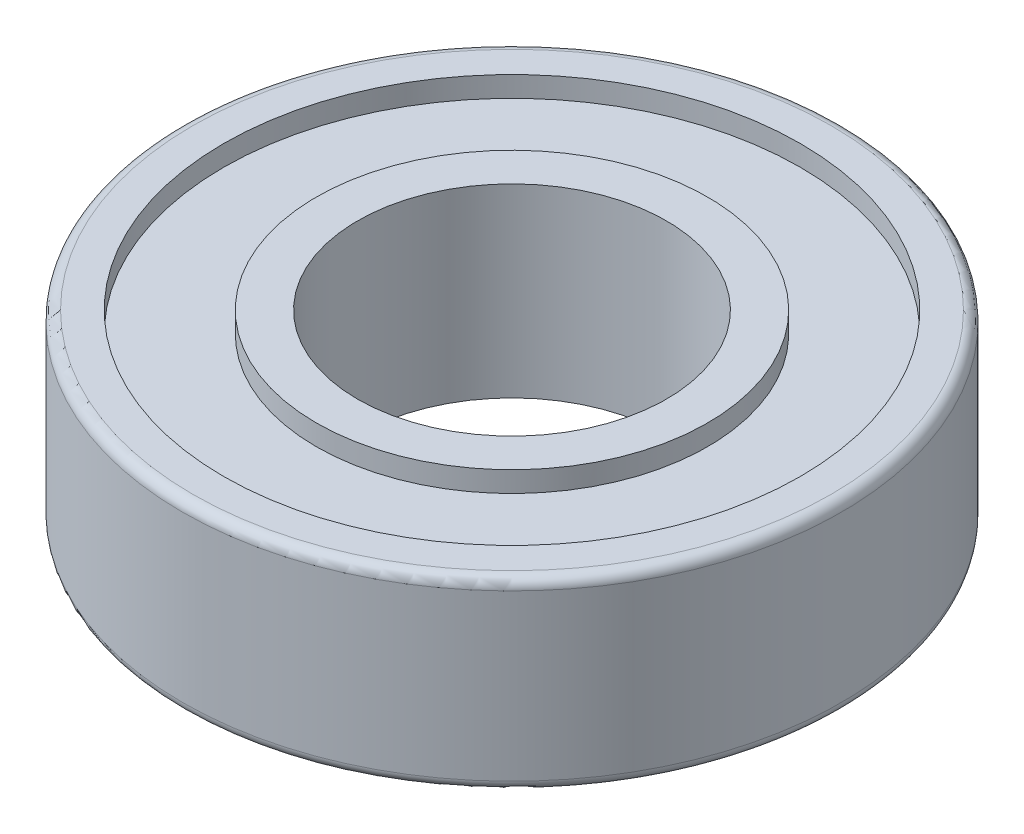
ISO-10303-21;
HEADER;
FILE_DESCRIPTION(('STEP AP214'),'2;1');
FILE_NAME('part.step','',(''),(''),'','','');
FILE_SCHEMA(('AUTOMOTIVE_DESIGN { 1 0 10303 214 1 1 1 1 }'));
ENDSEC;
DATA;
#1=APPLICATION_CONTEXT('core data for automotive mechanical design processes');
#2=APPLICATION_PROTOCOL_DEFINITION('international standard','automotive_design',2000,#1);
#3=PRODUCT_CONTEXT('',#1,'mechanical');
#4=PRODUCT('Part','Part','',(#3));
#5=PRODUCT_RELATED_PRODUCT_CATEGORY('part','',(#4));
#6=PRODUCT_DEFINITION_FORMATION('','',#4);
#7=PRODUCT_DEFINITION_CONTEXT('part definition',#1,'design');
#8=PRODUCT_DEFINITION('design','',#6,#7);
#9=PRODUCT_DEFINITION_SHAPE('','',#8);
#10=(LENGTH_UNIT() NAMED_UNIT(*) SI_UNIT(.MILLI.,.METRE.));
#11=(NAMED_UNIT(*) PLANE_ANGLE_UNIT() SI_UNIT($,.RADIAN.));
#12=(NAMED_UNIT(*) SI_UNIT($,.STERADIAN.) SOLID_ANGLE_UNIT());
#13=UNCERTAINTY_MEASURE_WITH_UNIT(LENGTH_MEASURE(1.E-05),#10,'distance_accuracy_value','');
#14=(GEOMETRIC_REPRESENTATION_CONTEXT(3) GLOBAL_UNCERTAINTY_ASSIGNED_CONTEXT((#13)) GLOBAL_UNIT_ASSIGNED_CONTEXT((#10,
#11,#12)) REPRESENTATION_CONTEXT('',''));
#15=CARTESIAN_POINT('',(0.,0.,0.));
#16=DIRECTION('',(0.,0.,1.));
#17=DIRECTION('',(1.,0.,0.));
#18=AXIS2_PLACEMENT_3D('',#15,#16,#17);
#19=CARTESIAN_POINT('',(0.,4.95,0.));
#20=DIRECTION('',(0.,1.,0.));
#21=DIRECTION('',(0.,0.,1.));
#22=AXIS2_PLACEMENT_3D('',#19,#20,#21);
#23=CYLINDRICAL_SURFACE('',#22,9.5);
#24=CARTESIAN_POINT('',(0.,-4.5,0.));
#25=DIRECTION('',(0.,1.,0.));
#26=DIRECTION('',(0.,0.,1.));
#27=AXIS2_PLACEMENT_3D('',#24,#25,#26);
#28=CIRCLE('',#27,9.5);
#29=CARTESIAN_POINT('',(0.,-4.5,9.5));
#30=VERTEX_POINT('',#29);
#31=EDGE_CURVE('E81',#30,#30,#28,.T.);
#32=ORIENTED_EDGE('',*,*,#31,.T.);
#33=EDGE_LOOP('',(#32));
#34=FACE_BOUND('',#33,.T.);
#35=CARTESIAN_POINT('',(0.,-3.5,0.));
#36=DIRECTION('',(0.,1.,0.));
#37=DIRECTION('',(0.,0.,1.));
#38=AXIS2_PLACEMENT_3D('',#35,#36,#37);
#39=CIRCLE('',#38,9.5);
#40=CARTESIAN_POINT('',(0.,-3.5,9.5));
#41=VERTEX_POINT('',#40);
#42=EDGE_CURVE('E73',#41,#41,#39,.T.);
#43=ORIENTED_EDGE('',*,*,#42,.F.);
#44=EDGE_LOOP('',(#43));
#45=FACE_BOUND('',#44,.T.);
#46=ADVANCED_FACE('F49',(#34,#45),#23,.T.);
#47=CARTESIAN_POINT('',(0.,4.5,0.));
#48=DIRECTION('',(0.,1.,0.));
#49=DIRECTION('',(0.,0.,1.));
#50=AXIS2_PLACEMENT_3D('',#47,#48,#49);
#51=CIRCLE('',#50,9.5);
#52=CARTESIAN_POINT('',(0.,4.5,9.5));
#53=VERTEX_POINT('',#52);
#54=EDGE_CURVE('E93',#53,#53,#51,.T.);
#55=ORIENTED_EDGE('',*,*,#54,.F.);
#56=EDGE_LOOP('',(#55));
#57=FACE_BOUND('',#56,.T.);
#58=CARTESIAN_POINT('',(0.,3.5,0.));
#59=DIRECTION('',(0.,-1.,0.));
#60=DIRECTION('',(0.,0.,-1.));
#61=AXIS2_PLACEMENT_3D('',#58,#59,#60);
#62=CIRCLE('',#61,9.5);
#63=CARTESIAN_POINT('',(0.,3.5,-9.5));
#64=VERTEX_POINT('',#63);
#65=EDGE_CURVE('E77',#64,#64,#62,.T.);
#66=ORIENTED_EDGE('',*,*,#65,.F.);
#67=EDGE_LOOP('',(#66));
#68=FACE_BOUND('',#67,.T.);
#69=ADVANCED_FACE('F131',(#57,#68),#23,.T.);
#70=CARTESIAN_POINT('',(7.5,-4.5,0.));
#71=DIRECTION('',(0.,1.,0.));
#72=DIRECTION('',(0.,0.,1.));
#73=AXIS2_PLACEMENT_3D('',#70,#71,#72);
#74=PLANE('',#73);
#75=ORIENTED_EDGE('',*,*,#31,.F.);
#76=EDGE_LOOP('',(#75));
#77=FACE_BOUND('',#76,.T.);
#78=CARTESIAN_POINT('',(0.,-4.5,0.));
#79=DIRECTION('',(0.,1.,0.));
#80=DIRECTION('',(0.,0.,1.));
#81=AXIS2_PLACEMENT_3D('',#78,#79,#80);
#82=CIRCLE('',#81,7.5);
#83=CARTESIAN_POINT('',(0.,-4.5,7.5));
#84=VERTEX_POINT('',#83);
#85=EDGE_CURVE('E85',#84,#84,#82,.T.);
#86=ORIENTED_EDGE('',*,*,#85,.T.);
#87=EDGE_LOOP('',(#86));
#88=FACE_BOUND('',#87,.T.);
#89=ADVANCED_FACE('F138',(#77,#88),#74,.F.);
#90=CARTESIAN_POINT('',(0.,4.95,0.));
#91=DIRECTION('',(0.,1.,0.));
#92=DIRECTION('',(0.,0.,1.));
#93=AXIS2_PLACEMENT_3D('',#90,#91,#92);
#94=CYLINDRICAL_SURFACE('',#93,7.5);
#95=ORIENTED_EDGE('',*,*,#85,.F.);
#96=EDGE_LOOP('',(#95));
#97=FACE_BOUND('',#96,.T.);
#98=CARTESIAN_POINT('',(0.,4.5,0.));
#99=DIRECTION('',(0.,1.,0.));
#100=DIRECTION('',(0.,0.,1.));
#101=AXIS2_PLACEMENT_3D('',#98,#99,#100);
#102=CIRCLE('',#101,7.5);
#103=CARTESIAN_POINT('',(0.,4.5,7.5));
#104=VERTEX_POINT('',#103);
#105=EDGE_CURVE('E89',#104,#104,#102,.T.);
#106=ORIENTED_EDGE('',*,*,#105,.T.);
#107=EDGE_LOOP('',(#106));
#108=FACE_BOUND('',#107,.T.);
#109=ADVANCED_FACE('F144',(#97,#108),#94,.F.);
#110=CARTESIAN_POINT('',(7.5,4.5,0.));
#111=DIRECTION('',(0.,-1.,0.));
#112=DIRECTION('',(0.,0.,-1.));
#113=AXIS2_PLACEMENT_3D('',#110,#111,#112);
#114=PLANE('',#113);
#115=ORIENTED_EDGE('',*,*,#105,.F.);
#116=EDGE_LOOP('',(#115));
#117=FACE_BOUND('',#116,.T.);
#118=ORIENTED_EDGE('',*,*,#54,.T.);
#119=EDGE_LOOP('',(#118));
#120=FACE_BOUND('',#119,.T.);
#121=ADVANCED_FACE('F148',(#117,#120),#114,.F.);
#122=CARTESIAN_POINT('',(9.5,-3.5,0.));
#123=DIRECTION('',(0.,1.,0.));
#124=DIRECTION('',(0.,0.,1.));
#125=AXIS2_PLACEMENT_3D('',#122,#123,#124);
#126=PLANE('',#125);
#127=CARTESIAN_POINT('',(0.,-3.5,0.));
#128=DIRECTION('',(0.,1.,0.));
#129=DIRECTION('',(0.,0.,1.));
#130=AXIS2_PLACEMENT_3D('',#127,#128,#129);
#131=CIRCLE('',#130,14.);
#132=CARTESIAN_POINT('',(0.,-3.5,14.));
#133=VERTEX_POINT('',#132);
#134=EDGE_CURVE('E97',#133,#133,#131,.T.);
#135=ORIENTED_EDGE('',*,*,#134,.F.);
#136=EDGE_LOOP('',(#135));
#137=FACE_BOUND('',#136,.T.);
#138=ORIENTED_EDGE('',*,*,#42,.T.);
#139=EDGE_LOOP('',(#138));
#140=FACE_BOUND('',#139,.T.);
#141=ADVANCED_FACE('F151',(#137,#140),#126,.F.);
#142=CARTESIAN_POINT('',(9.5,3.5,0.));
#143=DIRECTION('',(0.,-1.,0.));
#144=DIRECTION('',(0.,0.,-1.));
#145=AXIS2_PLACEMENT_3D('',#142,#143,#144);
#146=PLANE('',#145);
#147=ORIENTED_EDGE('',*,*,#65,.T.);
#148=EDGE_LOOP('',(#147));
#149=FACE_BOUND('',#148,.T.);
#150=CARTESIAN_POINT('',(0.,3.5,0.));
#151=DIRECTION('',(0.,-1.,0.));
#152=DIRECTION('',(0.,0.,-1.));
#153=AXIS2_PLACEMENT_3D('',#150,#151,#152);
#154=CIRCLE('',#153,14.);
#155=CARTESIAN_POINT('',(0.,3.5,-14.));
#156=VERTEX_POINT('',#155);
#157=EDGE_CURVE('E101',#156,#156,#154,.T.);
#158=ORIENTED_EDGE('',*,*,#157,.F.);
#159=EDGE_LOOP('',(#158));
#160=FACE_BOUND('',#159,.T.);
#161=ADVANCED_FACE('F155',(#149,#160),#146,.F.);
#162=CARTESIAN_POINT('',(0.,4.95,0.));
#163=DIRECTION('',(0.,1.,0.));
#164=DIRECTION('',(0.,0.,1.));
#165=AXIS2_PLACEMENT_3D('',#162,#163,#164);
#166=CYLINDRICAL_SURFACE('',#165,14.);
#167=CARTESIAN_POINT('',(0.,-4.5,0.));
#168=DIRECTION('',(0.,1.,0.));
#169=DIRECTION('',(0.,0.,1.));
#170=AXIS2_PLACEMENT_3D('',#167,#168,#169);
#171=CIRCLE('',#170,14.);
#172=CARTESIAN_POINT('',(0.,-4.5,14.));
#173=VERTEX_POINT('',#172);
#174=EDGE_CURVE('E105',#173,#173,#171,.T.);
#175=ORIENTED_EDGE('',*,*,#174,.F.);
#176=EDGE_LOOP('',(#175));
#177=FACE_BOUND('',#176,.T.);
#178=ORIENTED_EDGE('',*,*,#134,.T.);
#179=EDGE_LOOP('',(#178));
#180=FACE_BOUND('',#179,.T.);
#181=ADVANCED_FACE('F159',(#177,#180),#166,.F.);
#182=CARTESIAN_POINT('',(0.,4.5,0.));
#183=DIRECTION('',(0.,1.,0.));
#184=DIRECTION('',(0.,0.,1.));
#185=AXIS2_PLACEMENT_3D('',#182,#183,#184);
#186=CIRCLE('',#185,14.);
#187=CARTESIAN_POINT('',(0.,4.5,14.));
#188=VERTEX_POINT('',#187);
#189=EDGE_CURVE('E109',#188,#188,#186,.T.);
#190=ORIENTED_EDGE('',*,*,#189,.T.);
#191=EDGE_LOOP('',(#190));
#192=FACE_BOUND('',#191,.T.);
#193=ORIENTED_EDGE('',*,*,#157,.T.);
#194=EDGE_LOOP('',(#193));
#195=FACE_BOUND('',#194,.T.);
#196=ADVANCED_FACE('F114',(#192,#195),#166,.F.);
#197=CARTESIAN_POINT('',(0.,4.95,0.));
#198=DIRECTION('',(0.,1.,0.));
#199=DIRECTION('',(0.,0.,1.));
#200=AXIS2_PLACEMENT_3D('',#197,#198,#199);
#201=CYLINDRICAL_SURFACE('',#200,16.);
#202=CARTESIAN_POINT('',(0.,-4.,0.));
#203=DIRECTION('',(0.,1.,0.));
#204=DIRECTION('',(0.,0.,1.));
#205=AXIS2_PLACEMENT_3D('',#202,#203,#204);
#206=CIRCLE('',#205,16.);
#207=CARTESIAN_POINT('',(0.,-4.,16.));
#208=VERTEX_POINT('',#207);
#209=EDGE_CURVE('E62',#208,#208,#206,.T.);
#210=ORIENTED_EDGE('',*,*,#209,.T.);
#211=EDGE_LOOP('',(#210));
#212=FACE_BOUND('',#211,.T.);
#213=CARTESIAN_POINT('',(0.,4.,0.));
#214=DIRECTION('',(0.,-1.,0.));
#215=DIRECTION('',(0.,0.,-1.));
#216=AXIS2_PLACEMENT_3D('',#213,#214,#215);
#217=CIRCLE('',#216,16.);
#218=CARTESIAN_POINT('',(0.,4.,-16.));
#219=VERTEX_POINT('',#218);
#220=EDGE_CURVE('E67',#219,#219,#217,.T.);
#221=ORIENTED_EDGE('',*,*,#220,.T.);
#222=EDGE_LOOP('',(#221));
#223=FACE_BOUND('',#222,.T.);
#224=ADVANCED_FACE('F127',(#212,#223),#201,.T.);
#225=CARTESIAN_POINT('',(14.,-4.5,0.));
#226=DIRECTION('',(0.,1.,0.));
#227=DIRECTION('',(0.,0.,1.));
#228=AXIS2_PLACEMENT_3D('',#225,#226,#227);
#229=PLANE('',#228);
#230=CARTESIAN_POINT('',(0.,-4.5,0.));
#231=DIRECTION('',(0.,1.,0.));
#232=DIRECTION('',(0.,0.,1.));
#233=AXIS2_PLACEMENT_3D('',#230,#231,#232);
#234=CIRCLE('',#233,15.5);
#235=CARTESIAN_POINT('',(0.,-4.5,15.5));
#236=VERTEX_POINT('',#235);
#237=EDGE_CURVE('E57',#236,#236,#234,.F.);
#238=ORIENTED_EDGE('',*,*,#237,.T.);
#239=EDGE_LOOP('',(#238));
#240=FACE_BOUND('',#239,.T.);
#241=ORIENTED_EDGE('',*,*,#174,.T.);
#242=EDGE_LOOP('',(#241));
#243=FACE_BOUND('',#242,.T.);
#244=ADVANCED_FACE('F120',(#240,#243),#229,.F.);
#245=CARTESIAN_POINT('',(14.,4.5,0.));
#246=DIRECTION('',(0.,-1.,0.));
#247=DIRECTION('',(0.,0.,-1.));
#248=AXIS2_PLACEMENT_3D('',#245,#246,#247);
#249=PLANE('',#248);
#250=CARTESIAN_POINT('',(0.,4.5,0.));
#251=DIRECTION('',(0.,-1.,0.));
#252=DIRECTION('',(0.,0.,-1.));
#253=AXIS2_PLACEMENT_3D('',#250,#251,#252);
#254=CIRCLE('',#253,15.5);
#255=CARTESIAN_POINT('',(0.,4.5,-15.5));
#256=VERTEX_POINT('',#255);
#257=EDGE_CURVE('E10',#256,#256,#254,.F.);
#258=ORIENTED_EDGE('',*,*,#257,.T.);
#259=EDGE_LOOP('',(#258));
#260=FACE_BOUND('',#259,.T.);
#261=ORIENTED_EDGE('',*,*,#189,.F.);
#262=EDGE_LOOP('',(#261));
#263=FACE_BOUND('',#262,.T.);
#264=ADVANCED_FACE('F117',(#260,#263),#249,.F.);
#265=CARTESIAN_POINT('',(0.,-4.,0.));
#266=DIRECTION('',(0.,1.,0.));
#267=DIRECTION('',(0.,0.,1.));
#268=AXIS2_PLACEMENT_3D('',#265,#266,#267);
#269=TOROIDAL_SURFACE('',#268,15.5,0.5);
#270=ORIENTED_EDGE('',*,*,#237,.F.);
#271=EDGE_LOOP('',(#270));
#272=FACE_BOUND('',#271,.T.);
#273=ORIENTED_EDGE('',*,*,#209,.F.);
#274=EDGE_LOOP('',(#273));
#275=FACE_BOUND('',#274,.T.);
#276=ADVANCED_FACE('F119',(#272,#275),#269,.T.);
#277=CARTESIAN_POINT('',(0.,4.,0.));
#278=DIRECTION('',(0.,-1.,0.));
#279=DIRECTION('',(0.,0.,-1.));
#280=AXIS2_PLACEMENT_3D('',#277,#278,#279);
#281=TOROIDAL_SURFACE('',#280,15.5,0.5);
#282=ORIENTED_EDGE('',*,*,#220,.F.);
#283=EDGE_LOOP('',(#282));
#284=FACE_BOUND('',#283,.T.);
#285=ORIENTED_EDGE('',*,*,#257,.F.);
#286=EDGE_LOOP('',(#285));
#287=FACE_BOUND('',#286,.T.);
#288=ADVANCED_FACE('F51',(#284,#287),#281,.T.);
#289=CLOSED_SHELL('',(#46,#69,#89,#109,#121,#141,#161,#181,#196,#224,#244,#264,#276,#288));
#290=MANIFOLD_SOLID_BREP('B2',#289);
#291=ADVANCED_BREP_SHAPE_REPRESENTATION('',(#18,#290),#14);
#292=SHAPE_DEFINITION_REPRESENTATION(#9,#291);
ENDSEC;
END-ISO-10303-21;
